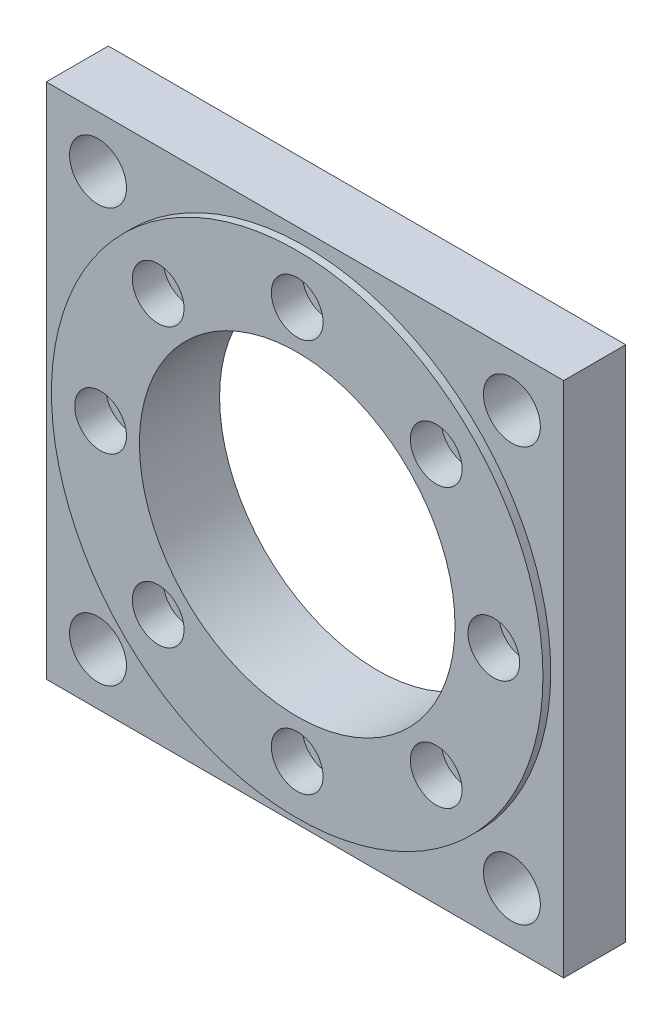
ISO-10303-21;
HEADER;
FILE_DESCRIPTION(('STEP AP214'),'2;1');
FILE_NAME('part.step','',(''),(''),'','','');
FILE_SCHEMA(('AUTOMOTIVE_DESIGN { 1 0 10303 214 1 1 1 1 }'));
ENDSEC;
DATA;
#1=APPLICATION_CONTEXT('core data for automotive mechanical design processes');
#2=APPLICATION_PROTOCOL_DEFINITION('international standard','automotive_design',2000,#1);
#3=PRODUCT_CONTEXT('',#1,'mechanical');
#4=PRODUCT('Part','Part','',(#3));
#5=PRODUCT_RELATED_PRODUCT_CATEGORY('part','',(#4));
#6=PRODUCT_DEFINITION_FORMATION('','',#4);
#7=PRODUCT_DEFINITION_CONTEXT('part definition',#1,'design');
#8=PRODUCT_DEFINITION('design','',#6,#7);
#9=PRODUCT_DEFINITION_SHAPE('','',#8);
#10=(LENGTH_UNIT() NAMED_UNIT(*) SI_UNIT(.MILLI.,.METRE.));
#11=(NAMED_UNIT(*) PLANE_ANGLE_UNIT() SI_UNIT($,.RADIAN.));
#12=(NAMED_UNIT(*) SI_UNIT($,.STERADIAN.) SOLID_ANGLE_UNIT());
#13=UNCERTAINTY_MEASURE_WITH_UNIT(LENGTH_MEASURE(1.E-05),#10,'distance_accuracy_value','');
#14=(GEOMETRIC_REPRESENTATION_CONTEXT(3) GLOBAL_UNCERTAINTY_ASSIGNED_CONTEXT((#13)) GLOBAL_UNIT_ASSIGNED_CONTEXT((#10,
#11,#12)) REPRESENTATION_CONTEXT('',''));
#15=CARTESIAN_POINT('',(0.,0.,0.));
#16=DIRECTION('',(0.,0.,1.));
#17=DIRECTION('',(1.,0.,0.));
#18=AXIS2_PLACEMENT_3D('',#15,#16,#17);
#19=CARTESIAN_POINT('',(-50.,-50.,14.));
#20=DIRECTION('',(0.,0.,1.));
#21=DIRECTION('',(1.,0.,0.));
#22=AXIS2_PLACEMENT_3D('',#19,#20,#21);
#23=PLANE('',#22);
#24=DIRECTION('',(0.,-1.,0.));
#25=VECTOR('',#24,1.);
#26=CARTESIAN_POINT('',(-50.,50.,14.));
#27=LINE('',#26,#25);
#28=CARTESIAN_POINT('',(-50.,50.,14.));
#29=VERTEX_POINT('',#28);
#30=CARTESIAN_POINT('',(-50.,-50.,14.));
#31=VERTEX_POINT('',#30);
#32=EDGE_CURVE('E85',#29,#31,#27,.T.);
#33=ORIENTED_EDGE('',*,*,#32,.T.);
#34=DIRECTION('',(1.,0.,0.));
#35=VECTOR('',#34,1.);
#36=CARTESIAN_POINT('',(-50.,-50.,14.));
#37=LINE('',#36,#35);
#38=CARTESIAN_POINT('',(50.,-50.,14.));
#39=VERTEX_POINT('',#38);
#40=EDGE_CURVE('E80',#31,#39,#37,.T.);
#41=ORIENTED_EDGE('',*,*,#40,.T.);
#42=DIRECTION('',(0.,1.,0.));
#43=VECTOR('',#42,1.);
#44=CARTESIAN_POINT('',(50.,50.,14.));
#45=LINE('',#44,#43);
#46=CARTESIAN_POINT('',(50.,50.,14.));
#47=VERTEX_POINT('',#46);
#48=EDGE_CURVE('E83',#39,#47,#45,.T.);
#49=ORIENTED_EDGE('',*,*,#48,.T.);
#50=DIRECTION('',(-1.,0.,0.));
#51=VECTOR('',#50,1.);
#52=CARTESIAN_POINT('',(-50.,50.,14.));
#53=LINE('',#52,#51);
#54=EDGE_CURVE('E49',#47,#29,#53,.T.);
#55=ORIENTED_EDGE('',*,*,#54,.T.);
#56=EDGE_LOOP('',(#33,#41,#49,#55));
#57=FACE_BOUND('',#56,.T.);
#58=CARTESIAN_POINT('',(-40.0000000000001,40.,14.));
#59=DIRECTION('',(0.,0.,1.));
#60=DIRECTION('',(1.,0.,0.));
#61=AXIS2_PLACEMENT_3D('',#58,#59,#60);
#62=CIRCLE('',#61,5.5);
#63=CARTESIAN_POINT('',(-34.5000000000001,40.,14.));
#64=VERTEX_POINT('',#63);
#65=EDGE_CURVE('E667',#64,#64,#62,.T.);
#66=ORIENTED_EDGE('',*,*,#65,.F.);
#67=EDGE_LOOP('',(#66));
#68=FACE_BOUND('',#67,.T.);
#69=CARTESIAN_POINT('',(39.9999999999999,40.,14.));
#70=DIRECTION('',(0.,0.,1.));
#71=DIRECTION('',(1.,0.,0.));
#72=AXIS2_PLACEMENT_3D('',#69,#70,#71);
#73=CIRCLE('',#72,5.5);
#74=CARTESIAN_POINT('',(45.4999999999999,40.,14.));
#75=VERTEX_POINT('',#74);
#76=EDGE_CURVE('E661',#75,#75,#73,.T.);
#77=ORIENTED_EDGE('',*,*,#76,.F.);
#78=EDGE_LOOP('',(#77));
#79=FACE_BOUND('',#78,.T.);
#80=CARTESIAN_POINT('',(-39.9999999999993,-40.,14.));
#81=DIRECTION('',(0.,0.,1.));
#82=DIRECTION('',(1.,0.,0.));
#83=AXIS2_PLACEMENT_3D('',#80,#81,#82);
#84=CIRCLE('',#83,5.5);
#85=CARTESIAN_POINT('',(-34.4999999999993,-40.,14.));
#86=VERTEX_POINT('',#85);
#87=EDGE_CURVE('E655',#86,#86,#84,.T.);
#88=ORIENTED_EDGE('',*,*,#87,.F.);
#89=EDGE_LOOP('',(#88));
#90=FACE_BOUND('',#89,.T.);
#91=CARTESIAN_POINT('',(40.0000000000007,-40.,14.));
#92=DIRECTION('',(0.,0.,1.));
#93=DIRECTION('',(1.,0.,0.));
#94=AXIS2_PLACEMENT_3D('',#91,#92,#93);
#95=CIRCLE('',#94,5.5);
#96=CARTESIAN_POINT('',(45.5000000000007,-40.,14.));
#97=VERTEX_POINT('',#96);
#98=EDGE_CURVE('E644',#97,#97,#95,.T.);
#99=ORIENTED_EDGE('',*,*,#98,.F.);
#100=EDGE_LOOP('',(#99));
#101=FACE_BOUND('',#100,.T.);
#102=CARTESIAN_POINT('',(0.,0.,14.));
#103=DIRECTION('',(0.,0.,1.));
#104=DIRECTION('',(1.,0.,0.));
#105=AXIS2_PLACEMENT_3D('',#102,#103,#104);
#106=CIRCLE('',#105,47.5);
#107=CARTESIAN_POINT('',(47.5,0.,14.));
#108=VERTEX_POINT('',#107);
#109=EDGE_CURVE('E640',#108,#108,#106,.T.);
#110=ORIENTED_EDGE('',*,*,#109,.F.);
#111=EDGE_LOOP('',(#110));
#112=FACE_BOUND('',#111,.T.);
#113=ADVANCED_FACE('F30',(#57,#68,#79,#90,#101,#112),#23,.T.);
#114=CARTESIAN_POINT('',(-26.8700576850877,26.87005768509,0.));
#115=DIRECTION('',(0.,0.,1.));
#116=DIRECTION('',(1.,0.,0.));
#117=AXIS2_PLACEMENT_3D('',#114,#115,#116);
#118=CYLINDRICAL_SURFACE('',#117,3.00000000000001);
#119=CARTESIAN_POINT('',(-26.8700576850877,26.87005768509,2.));
#120=DIRECTION('',(0.,0.,1.));
#121=DIRECTION('',(1.,0.,0.));
#122=AXIS2_PLACEMENT_3D('',#119,#120,#121);
#123=CIRCLE('',#122,3.00000000000001);
#124=CARTESIAN_POINT('',(-23.8700576850876,26.87005768509,2.));
#125=VERTEX_POINT('',#124);
#126=EDGE_CURVE('E115',#125,#125,#123,.T.);
#127=ORIENTED_EDGE('',*,*,#126,.F.);
#128=EDGE_LOOP('',(#127));
#129=FACE_BOUND('',#128,.T.);
#130=CARTESIAN_POINT('',(-26.8700576850877,26.87005768509,9.5));
#131=DIRECTION('',(0.,0.,1.));
#132=DIRECTION('',(1.,0.,0.));
#133=AXIS2_PLACEMENT_3D('',#130,#131,#132);
#134=CIRCLE('',#133,3.00000000000001);
#135=CARTESIAN_POINT('',(-23.8700576850876,26.87005768509,9.5));
#136=VERTEX_POINT('',#135);
#137=EDGE_CURVE('E34',#136,#136,#134,.F.);
#138=ORIENTED_EDGE('',*,*,#137,.F.);
#139=EDGE_LOOP('',(#138));
#140=FACE_BOUND('',#139,.T.);
#141=ADVANCED_FACE('F208',(#129,#140),#118,.F.);
#142=CARTESIAN_POINT('',(-38.,1.56805129870686E-12,0.));
#143=DIRECTION('',(0.,0.,1.));
#144=DIRECTION('',(1.,0.,0.));
#145=AXIS2_PLACEMENT_3D('',#142,#143,#144);
#146=CYLINDRICAL_SURFACE('',#145,3.);
#147=CARTESIAN_POINT('',(-38.,1.56805129870686E-12,2.));
#148=DIRECTION('',(0.,0.,1.));
#149=DIRECTION('',(1.,0.,0.));
#150=AXIS2_PLACEMENT_3D('',#147,#148,#149);
#151=CIRCLE('',#150,3.);
#152=CARTESIAN_POINT('',(-35.,1.56805129870686E-12,2.));
#153=VERTEX_POINT('',#152);
#154=EDGE_CURVE('E164',#153,#153,#151,.T.);
#155=ORIENTED_EDGE('',*,*,#154,.F.);
#156=EDGE_LOOP('',(#155));
#157=FACE_BOUND('',#156,.T.);
#158=CARTESIAN_POINT('',(-38.,1.56805129870686E-12,9.5));
#159=DIRECTION('',(0.,0.,1.));
#160=DIRECTION('',(1.,0.,0.));
#161=AXIS2_PLACEMENT_3D('',#158,#159,#160);
#162=CIRCLE('',#161,3.);
#163=CARTESIAN_POINT('',(-35.,1.56805129870686E-12,9.5));
#164=VERTEX_POINT('',#163);
#165=EDGE_CURVE('E136',#164,#164,#162,.F.);
#166=ORIENTED_EDGE('',*,*,#165,.F.);
#167=EDGE_LOOP('',(#166));
#168=FACE_BOUND('',#167,.T.);
#169=ADVANCED_FACE('F213',(#157,#168),#146,.F.);
#170=CARTESIAN_POINT('',(-26.8700576850899,-26.8700576850877,0.));
#171=DIRECTION('',(0.,0.,1.));
#172=DIRECTION('',(1.,0.,0.));
#173=AXIS2_PLACEMENT_3D('',#170,#171,#172);
#174=CYLINDRICAL_SURFACE('',#173,3.00000000000001);
#175=CARTESIAN_POINT('',(-26.8700576850899,-26.8700576850877,2.));
#176=DIRECTION('',(0.,0.,1.));
#177=DIRECTION('',(1.,0.,0.));
#178=AXIS2_PLACEMENT_3D('',#175,#176,#177);
#179=CIRCLE('',#178,3.00000000000001);
#180=CARTESIAN_POINT('',(-23.8700576850899,-26.8700576850877,2.));
#181=VERTEX_POINT('',#180);
#182=EDGE_CURVE('E167',#181,#181,#179,.T.);
#183=ORIENTED_EDGE('',*,*,#182,.F.);
#184=EDGE_LOOP('',(#183));
#185=FACE_BOUND('',#184,.T.);
#186=CARTESIAN_POINT('',(-26.8700576850899,-26.8700576850877,9.5));
#187=DIRECTION('',(0.,0.,1.));
#188=DIRECTION('',(1.,0.,0.));
#189=AXIS2_PLACEMENT_3D('',#186,#187,#188);
#190=CIRCLE('',#189,3.00000000000001);
#191=CARTESIAN_POINT('',(-23.8700576850899,-26.8700576850877,9.5));
#192=VERTEX_POINT('',#191);
#193=EDGE_CURVE('E133',#192,#192,#190,.F.);
#194=ORIENTED_EDGE('',*,*,#193,.F.);
#195=EDGE_LOOP('',(#194));
#196=FACE_BOUND('',#195,.T.);
#197=ADVANCED_FACE('F534',(#185,#196),#174,.F.);
#198=CARTESIAN_POINT('',(-1.4353749309847E-12,-38.,0.));
#199=DIRECTION('',(0.,0.,1.));
#200=DIRECTION('',(1.,0.,0.));
#201=AXIS2_PLACEMENT_3D('',#198,#199,#200);
#202=CYLINDRICAL_SURFACE('',#201,3.);
#203=CARTESIAN_POINT('',(-1.4353749309847E-12,-38.,2.));
#204=DIRECTION('',(0.,0.,1.));
#205=DIRECTION('',(1.,0.,0.));
#206=AXIS2_PLACEMENT_3D('',#203,#204,#205);
#207=CIRCLE('',#206,3.);
#208=CARTESIAN_POINT('',(2.99999999999857,-38.,2.));
#209=VERTEX_POINT('',#208);
#210=EDGE_CURVE('E170',#209,#209,#207,.T.);
#211=ORIENTED_EDGE('',*,*,#210,.F.);
#212=EDGE_LOOP('',(#211));
#213=FACE_BOUND('',#212,.T.);
#214=CARTESIAN_POINT('',(-1.4353749309847E-12,-38.,9.5));
#215=DIRECTION('',(0.,0.,1.));
#216=DIRECTION('',(1.,0.,0.));
#217=AXIS2_PLACEMENT_3D('',#214,#215,#216);
#218=CIRCLE('',#217,3.);
#219=CARTESIAN_POINT('',(2.99999999999857,-38.,9.5));
#220=VERTEX_POINT('',#219);
#221=EDGE_CURVE('E129',#220,#220,#218,.F.);
#222=ORIENTED_EDGE('',*,*,#221,.F.);
#223=EDGE_LOOP('',(#222));
#224=FACE_BOUND('',#223,.T.);
#225=ADVANCED_FACE('F525',(#213,#224),#202,.F.);
#226=CARTESIAN_POINT('',(26.8700576850878,-26.8700576850898,0.));
#227=DIRECTION('',(0.,0.,1.));
#228=DIRECTION('',(1.,0.,0.));
#229=AXIS2_PLACEMENT_3D('',#226,#227,#228);
#230=CYLINDRICAL_SURFACE('',#229,3.);
#231=CARTESIAN_POINT('',(26.8700576850878,-26.8700576850898,2.));
#232=DIRECTION('',(0.,0.,1.));
#233=DIRECTION('',(1.,0.,0.));
#234=AXIS2_PLACEMENT_3D('',#231,#232,#233);
#235=CIRCLE('',#234,3.);
#236=CARTESIAN_POINT('',(29.8700576850878,-26.8700576850898,2.));
#237=VERTEX_POINT('',#236);
#238=EDGE_CURVE('E173',#237,#237,#235,.T.);
#239=ORIENTED_EDGE('',*,*,#238,.F.);
#240=EDGE_LOOP('',(#239));
#241=FACE_BOUND('',#240,.T.);
#242=CARTESIAN_POINT('',(26.8700576850878,-26.8700576850898,9.5));
#243=DIRECTION('',(0.,0.,1.));
#244=DIRECTION('',(1.,0.,0.));
#245=AXIS2_PLACEMENT_3D('',#242,#243,#244);
#246=CIRCLE('',#245,3.);
#247=CARTESIAN_POINT('',(29.8700576850878,-26.8700576850898,9.5));
#248=VERTEX_POINT('',#247);
#249=EDGE_CURVE('E125',#248,#248,#246,.F.);
#250=ORIENTED_EDGE('',*,*,#249,.F.);
#251=EDGE_LOOP('',(#250));
#252=FACE_BOUND('',#251,.T.);
#253=ADVANCED_FACE('F516',(#241,#252),#230,.F.);
#254=CARTESIAN_POINT('',(38.,-1.30269856326255E-12,0.));
#255=DIRECTION('',(0.,0.,1.));
#256=DIRECTION('',(1.,0.,0.));
#257=AXIS2_PLACEMENT_3D('',#254,#255,#256);
#258=CYLINDRICAL_SURFACE('',#257,3.);
#259=CARTESIAN_POINT('',(38.,-1.30269856326255E-12,2.));
#260=DIRECTION('',(0.,0.,1.));
#261=DIRECTION('',(1.,0.,0.));
#262=AXIS2_PLACEMENT_3D('',#259,#260,#261);
#263=CIRCLE('',#262,3.);
#264=CARTESIAN_POINT('',(41.,-1.30269856326255E-12,2.));
#265=VERTEX_POINT('',#264);
#266=EDGE_CURVE('E176',#265,#265,#263,.T.);
#267=ORIENTED_EDGE('',*,*,#266,.F.);
#268=EDGE_LOOP('',(#267));
#269=FACE_BOUND('',#268,.T.);
#270=CARTESIAN_POINT('',(38.,-1.30269856326255E-12,9.5));
#271=DIRECTION('',(0.,0.,1.));
#272=DIRECTION('',(1.,0.,0.));
#273=AXIS2_PLACEMENT_3D('',#270,#271,#272);
#274=CIRCLE('',#273,3.);
#275=CARTESIAN_POINT('',(41.,-1.30269856326255E-12,9.5));
#276=VERTEX_POINT('',#275);
#277=EDGE_CURVE('E121',#276,#276,#274,.F.);
#278=ORIENTED_EDGE('',*,*,#277,.F.);
#279=EDGE_LOOP('',(#278));
#280=FACE_BOUND('',#279,.T.);
#281=ADVANCED_FACE('F507',(#269,#280),#258,.F.);
#282=CARTESIAN_POINT('',(26.8700576850897,26.8700576850879,0.));
#283=DIRECTION('',(0.,0.,1.));
#284=DIRECTION('',(1.,0.,0.));
#285=AXIS2_PLACEMENT_3D('',#282,#283,#284);
#286=CYLINDRICAL_SURFACE('',#285,3.00000000000001);
#287=CARTESIAN_POINT('',(26.8700576850897,26.8700576850879,2.));
#288=DIRECTION('',(0.,0.,1.));
#289=DIRECTION('',(1.,0.,0.));
#290=AXIS2_PLACEMENT_3D('',#287,#288,#289);
#291=CIRCLE('',#290,3.00000000000001);
#292=CARTESIAN_POINT('',(29.8700576850897,26.8700576850879,2.));
#293=VERTEX_POINT('',#292);
#294=EDGE_CURVE('E179',#293,#293,#291,.T.);
#295=ORIENTED_EDGE('',*,*,#294,.F.);
#296=EDGE_LOOP('',(#295));
#297=FACE_BOUND('',#296,.T.);
#298=CARTESIAN_POINT('',(26.8700576850897,26.8700576850879,9.5));
#299=DIRECTION('',(0.,0.,1.));
#300=DIRECTION('',(1.,0.,0.));
#301=AXIS2_PLACEMENT_3D('',#298,#299,#300);
#302=CIRCLE('',#301,3.00000000000001);
#303=CARTESIAN_POINT('',(29.8700576850897,26.8700576850879,9.5));
#304=VERTEX_POINT('',#303);
#305=EDGE_CURVE('E117',#304,#304,#302,.F.);
#306=ORIENTED_EDGE('',*,*,#305,.F.);
#307=EDGE_LOOP('',(#306));
#308=FACE_BOUND('',#307,.T.);
#309=ADVANCED_FACE('F203',(#297,#308),#286,.F.);
#310=CARTESIAN_POINT('',(2.26928138666442E-12,37.9999999999996,0.));
#311=DIRECTION('',(0.,0.,1.));
#312=DIRECTION('',(1.,0.,0.));
#313=AXIS2_PLACEMENT_3D('',#310,#311,#312);
#314=CYLINDRICAL_SURFACE('',#313,2.99999999999906);
#315=CARTESIAN_POINT('',(2.26928138666442E-12,37.9999999999996,2.));
#316=DIRECTION('',(0.,0.,1.));
#317=DIRECTION('',(1.,0.,0.));
#318=AXIS2_PLACEMENT_3D('',#315,#316,#317);
#319=CIRCLE('',#318,2.99999999999906);
#320=CARTESIAN_POINT('',(3.00000000000133,37.9999999999996,2.));
#321=VERTEX_POINT('',#320);
#322=EDGE_CURVE('E182',#321,#321,#319,.T.);
#323=ORIENTED_EDGE('',*,*,#322,.F.);
#324=EDGE_LOOP('',(#323));
#325=FACE_BOUND('',#324,.T.);
#326=CARTESIAN_POINT('',(2.26928138666442E-12,37.9999999999996,9.5));
#327=DIRECTION('',(0.,0.,1.));
#328=DIRECTION('',(1.,0.,0.));
#329=AXIS2_PLACEMENT_3D('',#326,#327,#328);
#330=CIRCLE('',#329,2.99999999999906);
#331=CARTESIAN_POINT('',(3.00000000000133,37.9999999999996,9.5));
#332=VERTEX_POINT('',#331);
#333=EDGE_CURVE('E112',#332,#332,#330,.F.);
#334=ORIENTED_EDGE('',*,*,#333,.F.);
#335=EDGE_LOOP('',(#334));
#336=FACE_BOUND('',#335,.T.);
#337=ADVANCED_FACE('F198',(#325,#336),#314,.F.);
#338=CARTESIAN_POINT('',(0.,0.,2.));
#339=DIRECTION('',(0.,0.,-1.));
#340=DIRECTION('',(-1.,0.,0.));
#341=AXIS2_PLACEMENT_3D('',#338,#339,#340);
#342=CYLINDRICAL_SURFACE('',#341,34.);
#343=CARTESIAN_POINT('',(0.,0.,2.));
#344=DIRECTION('',(0.,0.,1.));
#345=DIRECTION('',(1.,0.,0.));
#346=AXIS2_PLACEMENT_3D('',#343,#344,#345);
#347=CIRCLE('',#346,34.);
#348=CARTESIAN_POINT('',(34.,0.,2.));
#349=VERTEX_POINT('',#348);
#350=EDGE_CURVE('E11',#349,#349,#347,.T.);
#351=ORIENTED_EDGE('',*,*,#350,.F.);
#352=EDGE_LOOP('',(#351));
#353=FACE_BOUND('',#352,.T.);
#354=CARTESIAN_POINT('',(0.,0.,0.));
#355=DIRECTION('',(0.,0.,1.));
#356=DIRECTION('',(1.,0.,0.));
#357=AXIS2_PLACEMENT_3D('',#354,#355,#356);
#358=CIRCLE('',#357,34.);
#359=CARTESIAN_POINT('',(34.,0.,0.));
#360=VERTEX_POINT('',#359);
#361=EDGE_CURVE('E40',#360,#360,#358,.T.);
#362=ORIENTED_EDGE('',*,*,#361,.T.);
#363=EDGE_LOOP('',(#362));
#364=FACE_BOUND('',#363,.T.);
#365=ADVANCED_FACE('F32',(#353,#364),#342,.T.);
#366=CARTESIAN_POINT('',(0.,0.,0.));
#367=DIRECTION('',(0.,0.,1.));
#368=DIRECTION('',(1.,0.,0.));
#369=AXIS2_PLACEMENT_3D('',#366,#367,#368);
#370=PLANE('',#369);
#371=CARTESIAN_POINT('',(0.,0.,0.));
#372=DIRECTION('',(0.,0.,-1.));
#373=DIRECTION('',(-1.,0.,0.));
#374=AXIS2_PLACEMENT_3D('',#371,#372,#373);
#375=CIRCLE('',#374,30.5);
#376=CARTESIAN_POINT('',(-30.5,0.,0.));
#377=VERTEX_POINT('',#376);
#378=EDGE_CURVE('E103',#377,#377,#375,.T.);
#379=ORIENTED_EDGE('',*,*,#378,.F.);
#380=EDGE_LOOP('',(#379));
#381=FACE_BOUND('',#380,.T.);
#382=ORIENTED_EDGE('',*,*,#361,.F.);
#383=EDGE_LOOP('',(#382));
#384=FACE_BOUND('',#383,.T.);
#385=ADVANCED_FACE('F191',(#381,#384),#370,.F.);
#386=CARTESIAN_POINT('',(-50.,-50.,2.));
#387=DIRECTION('',(0.,0.,1.));
#388=DIRECTION('',(1.,0.,0.));
#389=AXIS2_PLACEMENT_3D('',#386,#387,#388);
#390=PLANE('',#389);
#391=CARTESIAN_POINT('',(40.0000000000007,-40.,2.));
#392=DIRECTION('',(0.,0.,1.));
#393=DIRECTION('',(1.,0.,0.));
#394=AXIS2_PLACEMENT_3D('',#391,#392,#393);
#395=CIRCLE('',#394,5.5);
#396=CARTESIAN_POINT('',(45.5000000000007,-40.,2.));
#397=VERTEX_POINT('',#396);
#398=EDGE_CURVE('E652',#397,#397,#395,.T.);
#399=ORIENTED_EDGE('',*,*,#398,.T.);
#400=EDGE_LOOP('',(#399));
#401=FACE_BOUND('',#400,.T.);
#402=CARTESIAN_POINT('',(-39.9999999999993,-40.,2.));
#403=DIRECTION('',(0.,0.,1.));
#404=DIRECTION('',(1.,0.,0.));
#405=AXIS2_PLACEMENT_3D('',#402,#403,#404);
#406=CIRCLE('',#405,5.5);
#407=CARTESIAN_POINT('',(-34.4999999999993,-40.,2.));
#408=VERTEX_POINT('',#407);
#409=EDGE_CURVE('E658',#408,#408,#406,.T.);
#410=ORIENTED_EDGE('',*,*,#409,.T.);
#411=EDGE_LOOP('',(#410));
#412=FACE_BOUND('',#411,.T.);
#413=CARTESIAN_POINT('',(39.9999999999999,40.,2.));
#414=DIRECTION('',(0.,0.,1.));
#415=DIRECTION('',(1.,0.,0.));
#416=AXIS2_PLACEMENT_3D('',#413,#414,#415);
#417=CIRCLE('',#416,5.5);
#418=CARTESIAN_POINT('',(45.4999999999999,40.,2.));
#419=VERTEX_POINT('',#418);
#420=EDGE_CURVE('E664',#419,#419,#417,.T.);
#421=ORIENTED_EDGE('',*,*,#420,.T.);
#422=EDGE_LOOP('',(#421));
#423=FACE_BOUND('',#422,.T.);
#424=CARTESIAN_POINT('',(-40.0000000000001,40.,2.));
#425=DIRECTION('',(0.,0.,1.));
#426=DIRECTION('',(1.,0.,0.));
#427=AXIS2_PLACEMENT_3D('',#424,#425,#426);
#428=CIRCLE('',#427,5.5);
#429=CARTESIAN_POINT('',(-34.5000000000001,40.,2.));
#430=VERTEX_POINT('',#429);
#431=EDGE_CURVE('E669',#430,#430,#428,.T.);
#432=ORIENTED_EDGE('',*,*,#431,.T.);
#433=EDGE_LOOP('',(#432));
#434=FACE_BOUND('',#433,.T.);
#435=ORIENTED_EDGE('',*,*,#126,.T.);
#436=EDGE_LOOP('',(#435));
#437=FACE_BOUND('',#436,.T.);
#438=ORIENTED_EDGE('',*,*,#154,.T.);
#439=EDGE_LOOP('',(#438));
#440=FACE_BOUND('',#439,.T.);
#441=ORIENTED_EDGE('',*,*,#182,.T.);
#442=EDGE_LOOP('',(#441));
#443=FACE_BOUND('',#442,.T.);
#444=ORIENTED_EDGE('',*,*,#210,.T.);
#445=EDGE_LOOP('',(#444));
#446=FACE_BOUND('',#445,.T.);
#447=ORIENTED_EDGE('',*,*,#238,.T.);
#448=EDGE_LOOP('',(#447));
#449=FACE_BOUND('',#448,.T.);
#450=ORIENTED_EDGE('',*,*,#266,.T.);
#451=EDGE_LOOP('',(#450));
#452=FACE_BOUND('',#451,.T.);
#453=ORIENTED_EDGE('',*,*,#294,.T.);
#454=EDGE_LOOP('',(#453));
#455=FACE_BOUND('',#454,.T.);
#456=ORIENTED_EDGE('',*,*,#322,.T.);
#457=EDGE_LOOP('',(#456));
#458=FACE_BOUND('',#457,.T.);
#459=DIRECTION('',(0.,-1.,0.));
#460=VECTOR('',#459,1.);
#461=CARTESIAN_POINT('',(-50.,50.,2.));
#462=LINE('',#461,#460);
#463=CARTESIAN_POINT('',(-50.,50.,2.));
#464=VERTEX_POINT('',#463);
#465=CARTESIAN_POINT('',(-50.,-50.,2.));
#466=VERTEX_POINT('',#465);
#467=EDGE_CURVE('E100',#464,#466,#462,.T.);
#468=ORIENTED_EDGE('',*,*,#467,.F.);
#469=DIRECTION('',(-1.,0.,0.));
#470=VECTOR('',#469,1.);
#471=CARTESIAN_POINT('',(-50.,50.,2.));
#472=LINE('',#471,#470);
#473=CARTESIAN_POINT('',(50.,50.,2.));
#474=VERTEX_POINT('',#473);
#475=EDGE_CURVE('E72',#474,#464,#472,.T.);
#476=ORIENTED_EDGE('',*,*,#475,.F.);
#477=DIRECTION('',(0.,1.,0.));
#478=VECTOR('',#477,1.);
#479=CARTESIAN_POINT('',(50.,50.,2.));
#480=LINE('',#479,#478);
#481=CARTESIAN_POINT('',(50.,-50.,2.));
#482=VERTEX_POINT('',#481);
#483=EDGE_CURVE('E66',#482,#474,#480,.T.);
#484=ORIENTED_EDGE('',*,*,#483,.F.);
#485=DIRECTION('',(1.,0.,0.));
#486=VECTOR('',#485,1.);
#487=CARTESIAN_POINT('',(-50.,-50.,2.));
#488=LINE('',#487,#486);
#489=EDGE_CURVE('E90',#466,#482,#488,.T.);
#490=ORIENTED_EDGE('',*,*,#489,.F.);
#491=EDGE_LOOP('',(#468,#476,#484,#490));
#492=FACE_BOUND('',#491,.T.);
#493=ORIENTED_EDGE('',*,*,#350,.T.);
#494=EDGE_LOOP('',(#493));
#495=FACE_BOUND('',#494,.T.);
#496=ADVANCED_FACE('F194',(#401,#412,#423,#434,#437,#440,#443,#446,#449,#452,#455,#458,#492,
#495),#390,.F.);
#497=CARTESIAN_POINT('',(-50.,50.,14.));
#498=DIRECTION('',(1.,0.,0.));
#499=DIRECTION('',(0.,1.,0.));
#500=AXIS2_PLACEMENT_3D('',#497,#498,#499);
#501=PLANE('',#500);
#502=ORIENTED_EDGE('',*,*,#467,.T.);
#503=DIRECTION('',(0.,0.,-1.));
#504=VECTOR('',#503,1.);
#505=CARTESIAN_POINT('',(-50.,-50.,14.));
#506=LINE('',#505,#504);
#507=EDGE_CURVE('E91',#31,#466,#506,.T.);
#508=ORIENTED_EDGE('',*,*,#507,.F.);
#509=ORIENTED_EDGE('',*,*,#32,.F.);
#510=DIRECTION('',(0.,0.,-1.));
#511=VECTOR('',#510,1.);
#512=CARTESIAN_POINT('',(-50.,50.,14.));
#513=LINE('',#512,#511);
#514=EDGE_CURVE('E96',#29,#464,#513,.T.);
#515=ORIENTED_EDGE('',*,*,#514,.T.);
#516=EDGE_LOOP('',(#502,#508,#509,#515));
#517=FACE_BOUND('',#516,.T.);
#518=ADVANCED_FACE('F220',(#517),#501,.F.);
#519=CARTESIAN_POINT('',(-50.,-50.,14.));
#520=DIRECTION('',(0.,1.,0.));
#521=DIRECTION('',(0.,0.,1.));
#522=AXIS2_PLACEMENT_3D('',#519,#520,#521);
#523=PLANE('',#522);
#524=ORIENTED_EDGE('',*,*,#489,.T.);
#525=DIRECTION('',(0.,0.,-1.));
#526=VECTOR('',#525,1.);
#527=CARTESIAN_POINT('',(50.,-50.,14.));
#528=LINE('',#527,#526);
#529=EDGE_CURVE('E88',#39,#482,#528,.T.);
#530=ORIENTED_EDGE('',*,*,#529,.F.);
#531=ORIENTED_EDGE('',*,*,#40,.F.);
#532=ORIENTED_EDGE('',*,*,#507,.T.);
#533=EDGE_LOOP('',(#524,#530,#531,#532));
#534=FACE_BOUND('',#533,.T.);
#535=ADVANCED_FACE('F89',(#534),#523,.F.);
#536=CARTESIAN_POINT('',(50.,50.,14.));
#537=DIRECTION('',(-1.,0.,0.));
#538=DIRECTION('',(0.,-1.,0.));
#539=AXIS2_PLACEMENT_3D('',#536,#537,#538);
#540=PLANE('',#539);
#541=ORIENTED_EDGE('',*,*,#483,.T.);
#542=DIRECTION('',(0.,0.,-1.));
#543=VECTOR('',#542,1.);
#544=CARTESIAN_POINT('',(50.,50.,14.));
#545=LINE('',#544,#543);
#546=EDGE_CURVE('E92',#47,#474,#545,.T.);
#547=ORIENTED_EDGE('',*,*,#546,.F.);
#548=ORIENTED_EDGE('',*,*,#48,.F.);
#549=ORIENTED_EDGE('',*,*,#529,.T.);
#550=EDGE_LOOP('',(#541,#547,#548,#549));
#551=FACE_BOUND('',#550,.T.);
#552=ADVANCED_FACE('F94',(#551),#540,.F.);
#553=CARTESIAN_POINT('',(-50.,50.,14.));
#554=DIRECTION('',(0.,-1.,0.));
#555=DIRECTION('',(0.,0.,-1.));
#556=AXIS2_PLACEMENT_3D('',#553,#554,#555);
#557=PLANE('',#556);
#558=ORIENTED_EDGE('',*,*,#475,.T.);
#559=ORIENTED_EDGE('',*,*,#514,.F.);
#560=ORIENTED_EDGE('',*,*,#54,.F.);
#561=ORIENTED_EDGE('',*,*,#546,.T.);
#562=EDGE_LOOP('',(#558,#559,#560,#561));
#563=FACE_BOUND('',#562,.T.);
#564=ADVANCED_FACE('F222',(#563),#557,.F.);
#565=CARTESIAN_POINT('',(0.,0.,14.));
#566=DIRECTION('',(0.,0.,-1.));
#567=DIRECTION('',(-1.,0.,0.));
#568=AXIS2_PLACEMENT_3D('',#565,#566,#567);
#569=CYLINDRICAL_SURFACE('',#568,30.5);
#570=ORIENTED_EDGE('',*,*,#378,.T.);
#571=EDGE_LOOP('',(#570));
#572=FACE_BOUND('',#571,.T.);
#573=CARTESIAN_POINT('',(0.,0.,15.5));
#574=DIRECTION('',(0.,0.,1.));
#575=DIRECTION('',(1.,0.,0.));
#576=AXIS2_PLACEMENT_3D('',#573,#574,#575);
#577=CIRCLE('',#576,30.5);
#578=CARTESIAN_POINT('',(30.5,0.,15.5));
#579=VERTEX_POINT('',#578);
#580=EDGE_CURVE('E642',#579,#579,#577,.T.);
#581=ORIENTED_EDGE('',*,*,#580,.T.);
#582=EDGE_LOOP('',(#581));
#583=FACE_BOUND('',#582,.T.);
#584=ADVANCED_FACE('F188',(#572,#583),#569,.F.);
#585=CARTESIAN_POINT('',(2.26928138666442E-12,37.9999999999996,9.5));
#586=DIRECTION('',(0.,0.,1.));
#587=DIRECTION('',(1.,0.,0.));
#588=AXIS2_PLACEMENT_3D('',#585,#586,#587);
#589=PLANE('',#588);
#590=CARTESIAN_POINT('',(2.26928138666442E-12,37.9999999999996,9.5));
#591=DIRECTION('',(0.,0.,1.));
#592=DIRECTION('',(1.,0.,0.));
#593=AXIS2_PLACEMENT_3D('',#590,#591,#592);
#594=CIRCLE('',#593,5.);
#595=CARTESIAN_POINT('',(5.00000000000227,37.9999999999996,9.5));
#596=VERTEX_POINT('',#595);
#597=EDGE_CURVE('E116',#596,#596,#594,.T.);
#598=ORIENTED_EDGE('',*,*,#597,.T.);
#599=EDGE_LOOP('',(#598));
#600=FACE_BOUND('',#599,.T.);
#601=ORIENTED_EDGE('',*,*,#333,.T.);
#602=EDGE_LOOP('',(#601));
#603=FACE_BOUND('',#602,.T.);
#604=ADVANCED_FACE('F257',(#600,#603),#589,.T.);
#605=CARTESIAN_POINT('',(2.26928138666442E-12,37.9999999999996,9.5));
#606=DIRECTION('',(0.,0.,1.));
#607=DIRECTION('',(1.,0.,0.));
#608=AXIS2_PLACEMENT_3D('',#605,#606,#607);
#609=CYLINDRICAL_SURFACE('',#608,5.);
#610=ORIENTED_EDGE('',*,*,#597,.F.);
#611=EDGE_LOOP('',(#610));
#612=FACE_BOUND('',#611,.T.);
#613=CARTESIAN_POINT('',(3.16813053802888E-12,37.9999999999993,15.5));
#614=DIRECTION('',(0.,0.,1.));
#615=DIRECTION('',(1.,0.,0.));
#616=AXIS2_PLACEMENT_3D('',#613,#614,#615);
#617=CIRCLE('',#616,5.);
#618=CARTESIAN_POINT('',(5.00000000000317,37.9999999999993,15.5));
#619=VERTEX_POINT('',#618);
#620=EDGE_CURVE('E647',#619,#619,#617,.T.);
#621=ORIENTED_EDGE('',*,*,#620,.T.);
#622=EDGE_LOOP('',(#621));
#623=FACE_BOUND('',#622,.T.);
#624=ADVANCED_FACE('F264',(#612,#623),#609,.F.);
#625=CARTESIAN_POINT('',(26.8700576850902,26.8700576850869,9.5));
#626=DIRECTION('',(0.,0.,1.));
#627=DIRECTION('',(1.,0.,0.));
#628=AXIS2_PLACEMENT_3D('',#625,#626,#627);
#629=PLANE('',#628);
#630=CARTESIAN_POINT('',(26.8700576850902,26.8700576850869,9.5));
#631=DIRECTION('',(0.,0.,1.));
#632=DIRECTION('',(1.,0.,0.));
#633=AXIS2_PLACEMENT_3D('',#630,#631,#632);
#634=CIRCLE('',#633,5.);
#635=CARTESIAN_POINT('',(31.8700576850902,26.8700576850869,9.5));
#636=VERTEX_POINT('',#635);
#637=EDGE_CURVE('E120',#636,#636,#634,.T.);
#638=ORIENTED_EDGE('',*,*,#637,.T.);
#639=EDGE_LOOP('',(#638));
#640=FACE_BOUND('',#639,.T.);
#641=ORIENTED_EDGE('',*,*,#305,.T.);
#642=EDGE_LOOP('',(#641));
#643=FACE_BOUND('',#642,.T.);
#644=ADVANCED_FACE('F273',(#640,#643),#629,.T.);
#645=CARTESIAN_POINT('',(26.8700576850902,26.8700576850869,9.5));
#646=DIRECTION('',(0.,0.,1.));
#647=DIRECTION('',(1.,0.,0.));
#648=AXIS2_PLACEMENT_3D('',#645,#646,#647);
#649=CYLINDRICAL_SURFACE('',#648,5.);
#650=ORIENTED_EDGE('',*,*,#637,.F.);
#651=EDGE_LOOP('',(#650));
#652=FACE_BOUND('',#651,.T.);
#653=CARTESIAN_POINT('',(26.8700576850901,26.870057685087,15.5));
#654=DIRECTION('',(0.,0.,1.));
#655=DIRECTION('',(1.,0.,0.));
#656=AXIS2_PLACEMENT_3D('',#653,#654,#655);
#657=CIRCLE('',#656,5.);
#658=CARTESIAN_POINT('',(31.8700576850901,26.870057685087,15.5));
#659=VERTEX_POINT('',#658);
#660=EDGE_CURVE('E698',#659,#659,#657,.T.);
#661=ORIENTED_EDGE('',*,*,#660,.T.);
#662=EDGE_LOOP('',(#661));
#663=FACE_BOUND('',#662,.T.);
#664=ADVANCED_FACE('F281',(#652,#663),#649,.F.);
#665=CARTESIAN_POINT('',(37.9999999999996,-2.40195775438657E-12,9.5));
#666=DIRECTION('',(0.,0.,1.));
#667=DIRECTION('',(1.,0.,0.));
#668=AXIS2_PLACEMENT_3D('',#665,#666,#667);
#669=PLANE('',#668);
#670=CARTESIAN_POINT('',(37.9999999999996,-2.40195775438657E-12,9.5));
#671=DIRECTION('',(0.,0.,1.));
#672=DIRECTION('',(1.,0.,0.));
#673=AXIS2_PLACEMENT_3D('',#670,#671,#672);
#674=CIRCLE('',#673,5.);
#675=CARTESIAN_POINT('',(42.9999999999996,-2.40195775438657E-12,9.5));
#676=VERTEX_POINT('',#675);
#677=EDGE_CURVE('E124',#676,#676,#674,.T.);
#678=ORIENTED_EDGE('',*,*,#677,.T.);
#679=EDGE_LOOP('',(#678));
#680=FACE_BOUND('',#679,.T.);
#681=ORIENTED_EDGE('',*,*,#277,.T.);
#682=EDGE_LOOP('',(#681));
#683=FACE_BOUND('',#682,.T.);
#684=ADVANCED_FACE('F289',(#680,#683),#669,.T.);
#685=CARTESIAN_POINT('',(37.9999999999996,-2.40195775438657E-12,9.5));
#686=DIRECTION('',(0.,0.,1.));
#687=DIRECTION('',(1.,0.,0.));
#688=AXIS2_PLACEMENT_3D('',#685,#686,#687);
#689=CYLINDRICAL_SURFACE('',#688,5.);
#690=ORIENTED_EDGE('',*,*,#677,.F.);
#691=EDGE_LOOP('',(#690));
#692=FACE_BOUND('',#691,.T.);
#693=CARTESIAN_POINT('',(37.9999999999996,-2.2103763438054E-12,15.5));
#694=DIRECTION('',(0.,0.,1.));
#695=DIRECTION('',(1.,0.,0.));
#696=AXIS2_PLACEMENT_3D('',#693,#694,#695);
#697=CIRCLE('',#696,5.);
#698=CARTESIAN_POINT('',(42.9999999999996,-2.2103763438054E-12,15.5));
#699=VERTEX_POINT('',#698);
#700=EDGE_CURVE('E695',#699,#699,#697,.T.);
#701=ORIENTED_EDGE('',*,*,#700,.T.);
#702=EDGE_LOOP('',(#701));
#703=FACE_BOUND('',#702,.T.);
#704=ADVANCED_FACE('F297',(#692,#703),#689,.F.);
#705=CARTESIAN_POINT('',(26.8700576850879,-26.8700576850898,9.5));
#706=DIRECTION('',(0.,0.,1.));
#707=DIRECTION('',(1.,0.,0.));
#708=AXIS2_PLACEMENT_3D('',#705,#706,#707);
#709=PLANE('',#708);
#710=CARTESIAN_POINT('',(26.8700576850879,-26.8700576850898,9.5));
#711=DIRECTION('',(0.,0.,1.));
#712=DIRECTION('',(1.,0.,0.));
#713=AXIS2_PLACEMENT_3D('',#710,#711,#712);
#714=CIRCLE('',#713,5.);
#715=CARTESIAN_POINT('',(31.8700576850879,-26.8700576850898,9.5));
#716=VERTEX_POINT('',#715);
#717=EDGE_CURVE('E128',#716,#716,#714,.T.);
#718=ORIENTED_EDGE('',*,*,#717,.T.);
#719=EDGE_LOOP('',(#718));
#720=FACE_BOUND('',#719,.T.);
#721=ORIENTED_EDGE('',*,*,#249,.T.);
#722=EDGE_LOOP('',(#721));
#723=FACE_BOUND('',#722,.T.);
#724=ADVANCED_FACE('F305',(#720,#723),#709,.T.);
#725=CARTESIAN_POINT('',(26.8700576850879,-26.8700576850898,9.5));
#726=DIRECTION('',(0.,0.,1.));
#727=DIRECTION('',(1.,0.,0.));
#728=AXIS2_PLACEMENT_3D('',#725,#726,#727);
#729=CYLINDRICAL_SURFACE('',#728,5.);
#730=ORIENTED_EDGE('',*,*,#717,.F.);
#731=EDGE_LOOP('',(#730));
#732=FACE_BOUND('',#731,.T.);
#733=CARTESIAN_POINT('',(26.8700576850869,-26.8700576850902,15.5));
#734=DIRECTION('',(0.,0.,1.));
#735=DIRECTION('',(1.,0.,0.));
#736=AXIS2_PLACEMENT_3D('',#733,#734,#735);
#737=CIRCLE('',#736,5.);
#738=CARTESIAN_POINT('',(31.8700576850869,-26.8700576850902,15.5));
#739=VERTEX_POINT('',#738);
#740=EDGE_CURVE('E692',#739,#739,#737,.T.);
#741=ORIENTED_EDGE('',*,*,#740,.T.);
#742=EDGE_LOOP('',(#741));
#743=FACE_BOUND('',#742,.T.);
#744=ADVANCED_FACE('F313',(#732,#743),#729,.F.);
#745=CARTESIAN_POINT('',(-1.18479786485191E-12,-37.9999999999996,9.5));
#746=DIRECTION('',(0.,0.,1.));
#747=DIRECTION('',(1.,0.,0.));
#748=AXIS2_PLACEMENT_3D('',#745,#746,#747);
#749=PLANE('',#748);
#750=CARTESIAN_POINT('',(-1.18479786485191E-12,-37.9999999999996,9.5));
#751=DIRECTION('',(0.,0.,1.));
#752=DIRECTION('',(1.,0.,0.));
#753=AXIS2_PLACEMENT_3D('',#750,#751,#752);
#754=CIRCLE('',#753,5.);
#755=CARTESIAN_POINT('',(4.99999999999882,-37.9999999999996,9.5));
#756=VERTEX_POINT('',#755);
#757=EDGE_CURVE('E132',#756,#756,#754,.T.);
#758=ORIENTED_EDGE('',*,*,#757,.T.);
#759=EDGE_LOOP('',(#758));
#760=FACE_BOUND('',#759,.T.);
#761=ORIENTED_EDGE('',*,*,#221,.T.);
#762=EDGE_LOOP('',(#761));
#763=FACE_BOUND('',#762,.T.);
#764=ADVANCED_FACE('F321',(#760,#763),#749,.T.);
#765=CARTESIAN_POINT('',(-1.18479786485191E-12,-37.9999999999996,9.5));
#766=DIRECTION('',(0.,0.,1.));
#767=DIRECTION('',(1.,0.,0.));
#768=AXIS2_PLACEMENT_3D('',#765,#766,#767);
#769=CYLINDRICAL_SURFACE('',#768,5.);
#770=ORIENTED_EDGE('',*,*,#757,.F.);
#771=EDGE_LOOP('',(#770));
#772=FACE_BOUND('',#771,.T.);
#773=CARTESIAN_POINT('',(-2.34305271152756E-12,-37.9999999999996,15.5));
#774=DIRECTION('',(0.,0.,1.));
#775=DIRECTION('',(1.,0.,0.));
#776=AXIS2_PLACEMENT_3D('',#773,#774,#775);
#777=CIRCLE('',#776,5.);
#778=CARTESIAN_POINT('',(4.99999999999766,-37.9999999999996,15.5));
#779=VERTEX_POINT('',#778);
#780=EDGE_CURVE('E689',#779,#779,#777,.T.);
#781=ORIENTED_EDGE('',*,*,#780,.T.);
#782=EDGE_LOOP('',(#781));
#783=FACE_BOUND('',#782,.T.);
#784=ADVANCED_FACE('F329',(#772,#783),#769,.F.);
#785=CARTESIAN_POINT('',(-26.8700576850892,-26.8700576850873,9.5));
#786=DIRECTION('',(0.,0.,1.));
#787=DIRECTION('',(1.,0.,0.));
#788=AXIS2_PLACEMENT_3D('',#785,#786,#787);
#789=PLANE('',#788);
#790=CARTESIAN_POINT('',(-26.8700576850892,-26.8700576850873,9.5));
#791=DIRECTION('',(0.,0.,1.));
#792=DIRECTION('',(1.,0.,0.));
#793=AXIS2_PLACEMENT_3D('',#790,#791,#792);
#794=CIRCLE('',#793,5.);
#795=CARTESIAN_POINT('',(-21.8700576850892,-26.8700576850873,9.5));
#796=VERTEX_POINT('',#795);
#797=EDGE_CURVE('E135',#796,#796,#794,.T.);
#798=ORIENTED_EDGE('',*,*,#797,.T.);
#799=EDGE_LOOP('',(#798));
#800=FACE_BOUND('',#799,.T.);
#801=ORIENTED_EDGE('',*,*,#193,.T.);
#802=EDGE_LOOP('',(#801));
#803=FACE_BOUND('',#802,.T.);
#804=ADVANCED_FACE('F337',(#800,#803),#789,.T.);
#805=CARTESIAN_POINT('',(-26.8700576850892,-26.8700576850873,9.5));
#806=DIRECTION('',(0.,0.,1.));
#807=DIRECTION('',(1.,0.,0.));
#808=AXIS2_PLACEMENT_3D('',#805,#806,#807);
#809=CYLINDRICAL_SURFACE('',#808,5.);
#810=ORIENTED_EDGE('',*,*,#797,.F.);
#811=EDGE_LOOP('',(#810));
#812=FACE_BOUND('',#811,.T.);
#813=CARTESIAN_POINT('',(-26.8700576850902,-26.8700576850868,15.5));
#814=DIRECTION('',(0.,0.,1.));
#815=DIRECTION('',(1.,0.,0.));
#816=AXIS2_PLACEMENT_3D('',#813,#814,#815);
#817=CIRCLE('',#816,5.);
#818=CARTESIAN_POINT('',(-21.8700576850902,-26.8700576850868,15.5));
#819=VERTEX_POINT('',#818);
#820=EDGE_CURVE('E684',#819,#819,#817,.T.);
#821=ORIENTED_EDGE('',*,*,#820,.T.);
#822=EDGE_LOOP('',(#821));
#823=FACE_BOUND('',#822,.T.);
#824=ADVANCED_FACE('F345',(#812,#823),#809,.F.);
#825=CARTESIAN_POINT('',(-37.9999999999991,1.72245530134007E-12,9.5));
#826=DIRECTION('',(0.,0.,1.));
#827=DIRECTION('',(1.,0.,0.));
#828=AXIS2_PLACEMENT_3D('',#825,#826,#827);
#829=PLANE('',#828);
#830=CARTESIAN_POINT('',(-37.9999999999991,1.72245530134007E-12,9.5));
#831=DIRECTION('',(0.,0.,1.));
#832=DIRECTION('',(1.,0.,0.));
#833=AXIS2_PLACEMENT_3D('',#830,#831,#832);
#834=CIRCLE('',#833,5.);
#835=CARTESIAN_POINT('',(-32.9999999999991,1.72245530134007E-12,9.5));
#836=VERTEX_POINT('',#835);
#837=EDGE_CURVE('E138',#836,#836,#834,.T.);
#838=ORIENTED_EDGE('',*,*,#837,.T.);
#839=EDGE_LOOP('',(#838));
#840=FACE_BOUND('',#839,.T.);
#841=ORIENTED_EDGE('',*,*,#165,.T.);
#842=EDGE_LOOP('',(#841));
#843=FACE_BOUND('',#842,.T.);
#844=ADVANCED_FACE('F353',(#840,#843),#829,.T.);
#845=CARTESIAN_POINT('',(-37.9999999999991,1.72245530134007E-12,9.5));
#846=DIRECTION('',(0.,0.,1.));
#847=DIRECTION('',(1.,0.,0.));
#848=AXIS2_PLACEMENT_3D('',#845,#846,#847);
#849=CYLINDRICAL_SURFACE('',#848,5.);
#850=ORIENTED_EDGE('',*,*,#837,.F.);
#851=EDGE_LOOP('',(#850));
#852=FACE_BOUND('',#851,.T.);
#853=CARTESIAN_POINT('',(-37.9999999999996,2.48266797315362E-12,15.5));
#854=DIRECTION('',(0.,0.,1.));
#855=DIRECTION('',(1.,0.,0.));
#856=AXIS2_PLACEMENT_3D('',#853,#854,#855);
#857=CIRCLE('',#856,5.);
#858=CARTESIAN_POINT('',(-32.9999999999996,2.48266797315362E-12,15.5));
#859=VERTEX_POINT('',#858);
#860=EDGE_CURVE('E681',#859,#859,#857,.T.);
#861=ORIENTED_EDGE('',*,*,#860,.T.);
#862=EDGE_LOOP('',(#861));
#863=FACE_BOUND('',#862,.T.);
#864=ADVANCED_FACE('F361',(#852,#863),#849,.F.);
#865=CARTESIAN_POINT('',(-26.8700576850866,26.8700576850905,9.5));
#866=DIRECTION('',(0.,0.,1.));
#867=DIRECTION('',(1.,0.,0.));
#868=AXIS2_PLACEMENT_3D('',#865,#866,#867);
#869=PLANE('',#868);
#870=CARTESIAN_POINT('',(-26.8700576850866,26.8700576850905,9.5));
#871=DIRECTION('',(0.,0.,1.));
#872=DIRECTION('',(1.,0.,0.));
#873=AXIS2_PLACEMENT_3D('',#870,#871,#872);
#874=CIRCLE('',#873,5.);
#875=CARTESIAN_POINT('',(-21.8700576850866,26.8700576850905,9.5));
#876=VERTEX_POINT('',#875);
#877=EDGE_CURVE('E148',#876,#876,#874,.T.);
#878=ORIENTED_EDGE('',*,*,#877,.T.);
#879=EDGE_LOOP('',(#878));
#880=FACE_BOUND('',#879,.T.);
#881=ORIENTED_EDGE('',*,*,#137,.T.);
#882=EDGE_LOOP('',(#881));
#883=FACE_BOUND('',#882,.T.);
#884=ADVANCED_FACE('F368',(#880,#883),#869,.T.);
#885=CARTESIAN_POINT('',(-26.8700576850866,26.8700576850905,9.5));
#886=DIRECTION('',(0.,0.,1.));
#887=DIRECTION('',(1.,0.,0.));
#888=AXIS2_PLACEMENT_3D('',#885,#886,#887);
#889=CYLINDRICAL_SURFACE('',#888,5.);
#890=ORIENTED_EDGE('',*,*,#877,.F.);
#891=EDGE_LOOP('',(#890));
#892=FACE_BOUND('',#891,.T.);
#893=CARTESIAN_POINT('',(-26.8700576850868,26.8700576850903,15.5));
#894=DIRECTION('',(0.,0.,1.));
#895=DIRECTION('',(1.,0.,0.));
#896=AXIS2_PLACEMENT_3D('',#893,#894,#895);
#897=CIRCLE('',#896,5.);
#898=CARTESIAN_POINT('',(-21.8700576850868,26.8700576850903,15.5));
#899=VERTEX_POINT('',#898);
#900=EDGE_CURVE('E679',#899,#899,#897,.T.);
#901=ORIENTED_EDGE('',*,*,#900,.T.);
#902=EDGE_LOOP('',(#901));
#903=FACE_BOUND('',#902,.T.);
#904=ADVANCED_FACE('F376',(#892,#903),#889,.F.);
#905=CARTESIAN_POINT('',(-40.0000000000001,40.,-36.));
#906=DIRECTION('',(0.,0.,1.));
#907=DIRECTION('',(1.,0.,0.));
#908=AXIS2_PLACEMENT_3D('',#905,#906,#907);
#909=CYLINDRICAL_SURFACE('',#908,5.5);
#910=ORIENTED_EDGE('',*,*,#65,.T.);
#911=EDGE_LOOP('',(#910));
#912=FACE_BOUND('',#911,.T.);
#913=ORIENTED_EDGE('',*,*,#431,.F.);
#914=EDGE_LOOP('',(#913));
#915=FACE_BOUND('',#914,.T.);
#916=ADVANCED_FACE('F383',(#912,#915),#909,.F.);
#917=CARTESIAN_POINT('',(39.9999999999999,40.,-36.));
#918=DIRECTION('',(0.,0.,1.));
#919=DIRECTION('',(1.,0.,0.));
#920=AXIS2_PLACEMENT_3D('',#917,#918,#919);
#921=CYLINDRICAL_SURFACE('',#920,5.5);
#922=ORIENTED_EDGE('',*,*,#76,.T.);
#923=EDGE_LOOP('',(#922));
#924=FACE_BOUND('',#923,.T.);
#925=ORIENTED_EDGE('',*,*,#420,.F.);
#926=EDGE_LOOP('',(#925));
#927=FACE_BOUND('',#926,.T.);
#928=ADVANCED_FACE('F392',(#924,#927),#921,.F.);
#929=CARTESIAN_POINT('',(-39.9999999999993,-40.,-36.));
#930=DIRECTION('',(0.,0.,1.));
#931=DIRECTION('',(1.,0.,0.));
#932=AXIS2_PLACEMENT_3D('',#929,#930,#931);
#933=CYLINDRICAL_SURFACE('',#932,5.5);
#934=ORIENTED_EDGE('',*,*,#87,.T.);
#935=EDGE_LOOP('',(#934));
#936=FACE_BOUND('',#935,.T.);
#937=ORIENTED_EDGE('',*,*,#409,.F.);
#938=EDGE_LOOP('',(#937));
#939=FACE_BOUND('',#938,.T.);
#940=ADVANCED_FACE('F400',(#936,#939),#933,.F.);
#941=CARTESIAN_POINT('',(40.0000000000007,-40.,-36.));
#942=DIRECTION('',(0.,0.,1.));
#943=DIRECTION('',(1.,0.,0.));
#944=AXIS2_PLACEMENT_3D('',#941,#942,#943);
#945=CYLINDRICAL_SURFACE('',#944,5.5);
#946=ORIENTED_EDGE('',*,*,#98,.T.);
#947=EDGE_LOOP('',(#946));
#948=FACE_BOUND('',#947,.T.);
#949=ORIENTED_EDGE('',*,*,#398,.F.);
#950=EDGE_LOOP('',(#949));
#951=FACE_BOUND('',#950,.T.);
#952=ADVANCED_FACE('F408',(#948,#951),#945,.F.);
#953=CARTESIAN_POINT('',(0.,0.,15.5));
#954=DIRECTION('',(0.,0.,1.));
#955=DIRECTION('',(1.,0.,0.));
#956=AXIS2_PLACEMENT_3D('',#953,#954,#955);
#957=PLANE('',#956);
#958=ORIENTED_EDGE('',*,*,#860,.F.);
#959=EDGE_LOOP('',(#958));
#960=FACE_BOUND('',#959,.T.);
#961=ORIENTED_EDGE('',*,*,#780,.F.);
#962=EDGE_LOOP('',(#961));
#963=FACE_BOUND('',#962,.T.);
#964=ORIENTED_EDGE('',*,*,#700,.F.);
#965=EDGE_LOOP('',(#964));
#966=FACE_BOUND('',#965,.T.);
#967=ORIENTED_EDGE('',*,*,#620,.F.);
#968=EDGE_LOOP('',(#967));
#969=FACE_BOUND('',#968,.T.);
#970=CARTESIAN_POINT('',(0.,0.,15.5));
#971=DIRECTION('',(0.,0.,1.));
#972=DIRECTION('',(1.,0.,0.));
#973=AXIS2_PLACEMENT_3D('',#970,#971,#972);
#974=CIRCLE('',#973,47.5);
#975=CARTESIAN_POINT('',(47.5,0.,15.5));
#976=VERTEX_POINT('',#975);
#977=EDGE_CURVE('E637',#976,#976,#974,.T.);
#978=ORIENTED_EDGE('',*,*,#977,.T.);
#979=EDGE_LOOP('',(#978));
#980=FACE_BOUND('',#979,.T.);
#981=ORIENTED_EDGE('',*,*,#580,.F.);
#982=EDGE_LOOP('',(#981));
#983=FACE_BOUND('',#982,.T.);
#984=ORIENTED_EDGE('',*,*,#660,.F.);
#985=EDGE_LOOP('',(#984));
#986=FACE_BOUND('',#985,.T.);
#987=ORIENTED_EDGE('',*,*,#740,.F.);
#988=EDGE_LOOP('',(#987));
#989=FACE_BOUND('',#988,.T.);
#990=ORIENTED_EDGE('',*,*,#820,.F.);
#991=EDGE_LOOP('',(#990));
#992=FACE_BOUND('',#991,.T.);
#993=ORIENTED_EDGE('',*,*,#900,.F.);
#994=EDGE_LOOP('',(#993));
#995=FACE_BOUND('',#994,.T.);
#996=ADVANCED_FACE('F416',(#960,#963,#966,#969,#980,#983,#986,#989,#992,#995),#957,.T.);
#997=CARTESIAN_POINT('',(0.,0.,15.5));
#998=DIRECTION('',(0.,0.,-1.));
#999=DIRECTION('',(-1.,0.,0.));
#1000=AXIS2_PLACEMENT_3D('',#997,#998,#999);
#1001=CYLINDRICAL_SURFACE('',#1000,47.5);
#1002=ORIENTED_EDGE('',*,*,#977,.F.);
#1003=EDGE_LOOP('',(#1002));
#1004=FACE_BOUND('',#1003,.T.);
#1005=ORIENTED_EDGE('',*,*,#109,.T.);
#1006=EDGE_LOOP('',(#1005));
#1007=FACE_BOUND('',#1006,.T.);
#1008=ADVANCED_FACE('F423',(#1004,#1007),#1001,.T.);
#1009=CLOSED_SHELL('',(#113,#141,#169,#197,#225,#253,#281,#309,#337,#365,#385,#496,#518,#535,
#552,#564,#584,#604,#624,#644,#664,#684,#704,#724,#744,#764,#784,#804,#824,#844,#864,#884,#904,
#916,#928,#940,#952,#996,#1008));
#1010=MANIFOLD_SOLID_BREP('B2',#1009);
#1011=ADVANCED_BREP_SHAPE_REPRESENTATION('',(#18,#1010),#14);
#1012=SHAPE_DEFINITION_REPRESENTATION(#9,#1011);
ENDSEC;
END-ISO-10303-21;
